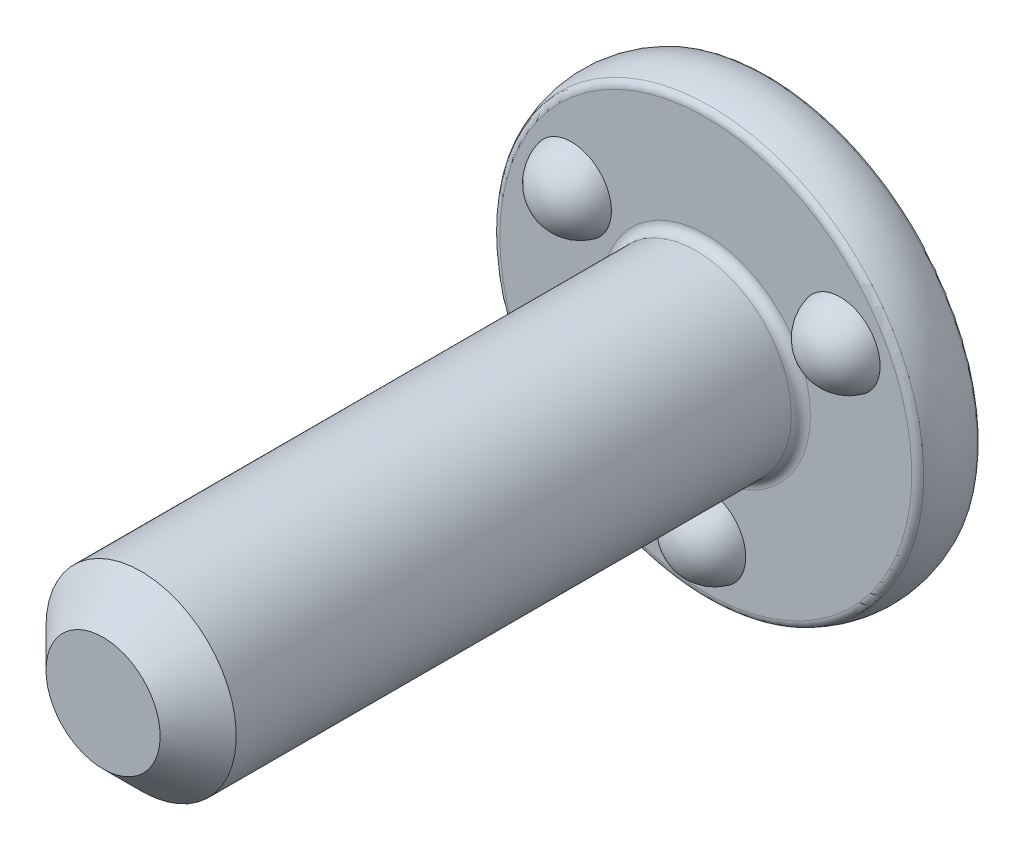
ISO-10303-21;
HEADER;
FILE_DESCRIPTION(('STEP AP214'),'2;1');
FILE_NAME('part.step','',(''),(''),'','','');
FILE_SCHEMA(('AUTOMOTIVE_DESIGN { 1 0 10303 214 1 1 1 1 }'));
ENDSEC;
DATA;
#1=APPLICATION_CONTEXT('core data for automotive mechanical design processes');
#2=APPLICATION_PROTOCOL_DEFINITION('international standard','automotive_design',2000,#1);
#3=PRODUCT_CONTEXT('',#1,'mechanical');
#4=PRODUCT('Part','Part','',(#3));
#5=PRODUCT_RELATED_PRODUCT_CATEGORY('part','',(#4));
#6=PRODUCT_DEFINITION_FORMATION('','',#4);
#7=PRODUCT_DEFINITION_CONTEXT('part definition',#1,'design');
#8=PRODUCT_DEFINITION('design','',#6,#7);
#9=PRODUCT_DEFINITION_SHAPE('','',#8);
#10=(LENGTH_UNIT() NAMED_UNIT(*) SI_UNIT(.MILLI.,.METRE.));
#11=(NAMED_UNIT(*) PLANE_ANGLE_UNIT() SI_UNIT($,.RADIAN.));
#12=(NAMED_UNIT(*) SI_UNIT($,.STERADIAN.) SOLID_ANGLE_UNIT());
#13=UNCERTAINTY_MEASURE_WITH_UNIT(LENGTH_MEASURE(1.E-05),#10,'distance_accuracy_value','');
#14=(GEOMETRIC_REPRESENTATION_CONTEXT(3) GLOBAL_UNCERTAINTY_ASSIGNED_CONTEXT((#13)) GLOBAL_UNIT_ASSIGNED_CONTEXT((#10,
#11,#12)) REPRESENTATION_CONTEXT('',''));
#15=CARTESIAN_POINT('',(0.,0.,0.));
#16=DIRECTION('',(0.,0.,1.));
#17=DIRECTION('',(1.,0.,0.));
#18=AXIS2_PLACEMENT_3D('',#15,#16,#17);
#19=CARTESIAN_POINT('',(0.,0.,-8.6868));
#20=DIRECTION('',(0.,0.,-1.));
#21=DIRECTION('',(-1.,0.,0.));
#22=AXIS2_PLACEMENT_3D('',#19,#20,#21);
#23=TOROIDAL_SURFACE('',#22,3.4925,0.3175);
#24=CARTESIAN_POINT('',(0.,0.,-8.6868));
#25=DIRECTION('',(0.,0.,-1.));
#26=DIRECTION('',(-1.,0.,0.));
#27=AXIS2_PLACEMENT_3D('',#24,#25,#26);
#28=CIRCLE('',#27,3.175);
#29=CARTESIAN_POINT('',(-3.175,0.,-8.6868));
#30=VERTEX_POINT('',#29);
#31=EDGE_CURVE('E74',#30,#30,#28,.T.);
#32=ORIENTED_EDGE('',*,*,#31,.T.);
#33=EDGE_LOOP('',(#32));
#34=FACE_BOUND('',#33,.T.);
#35=CARTESIAN_POINT('',(0.,0.,-9.0043));
#36=DIRECTION('',(0.,0.,-1.));
#37=DIRECTION('',(-1.,0.,0.));
#38=AXIS2_PLACEMENT_3D('',#35,#36,#37);
#39=CIRCLE('',#38,3.4925);
#40=CARTESIAN_POINT('',(-3.4925,0.,-9.0043));
#41=VERTEX_POINT('',#40);
#42=EDGE_CURVE('E10',#41,#41,#39,.T.);
#43=ORIENTED_EDGE('',*,*,#42,.F.);
#44=EDGE_LOOP('',(#43));
#45=FACE_BOUND('',#44,.T.);
#46=ADVANCED_FACE('F39',(#34,#45),#23,.F.);
#47=CARTESIAN_POINT('',(0.,3.4925,-9.0043));
#48=DIRECTION('',(0.,0.,1.));
#49=DIRECTION('',(1.,0.,0.));
#50=AXIS2_PLACEMENT_3D('',#47,#48,#49);
#51=PLANE('',#50);
#52=CARTESIAN_POINT('',(-4.48464760159246,2.58921249999996,-9.0043));
#53=DIRECTION('',(0.,0.,-1.));
#54=DIRECTION('',(0.499999999999992,0.866025403784443,0.));
#55=AXIS2_PLACEMENT_3D('',#52,#53,#54);
#56=CIRCLE('',#55,1.3335);
#57=CARTESIAN_POINT('',(-3.81789760159247,3.74405737594651,-9.0043));
#58=VERTEX_POINT('',#57);
#59=EDGE_CURVE('E86',#58,#58,#56,.T.);
#60=ORIENTED_EDGE('',*,*,#59,.T.);
#61=EDGE_LOOP('',(#60));
#62=FACE_BOUND('',#61,.T.);
#63=CARTESIAN_POINT('',(4.48464760159242,2.58921250000002,-9.0043));
#64=DIRECTION('',(0.,0.,-1.));
#65=DIRECTION('',(0.500000000000004,-0.866025403784436,0.));
#66=AXIS2_PLACEMENT_3D('',#63,#64,#65);
#67=CIRCLE('',#66,1.3335);
#68=CARTESIAN_POINT('',(5.15139760159243,1.43436762405348,-9.0043));
#69=VERTEX_POINT('',#68);
#70=EDGE_CURVE('E82',#69,#69,#67,.T.);
#71=ORIENTED_EDGE('',*,*,#70,.T.);
#72=EDGE_LOOP('',(#71));
#73=FACE_BOUND('',#72,.T.);
#74=CARTESIAN_POINT('',(0.,-5.178425,-9.0043));
#75=DIRECTION('',(0.,0.,-1.));
#76=DIRECTION('',(-1.,0.,0.));
#77=AXIS2_PLACEMENT_3D('',#74,#75,#76);
#78=CIRCLE('',#77,1.3335);
#79=CARTESIAN_POINT('',(-1.3335,-5.178425,-9.0043));
#80=VERTEX_POINT('',#79);
#81=EDGE_CURVE('E78',#80,#80,#78,.T.);
#82=ORIENTED_EDGE('',*,*,#81,.T.);
#83=EDGE_LOOP('',(#82));
#84=FACE_BOUND('',#83,.T.);
#85=ORIENTED_EDGE('',*,*,#42,.T.);
#86=EDGE_LOOP('',(#85));
#87=FACE_BOUND('',#86,.T.);
#88=CARTESIAN_POINT('',(0.,0.,-9.0043));
#89=DIRECTION('',(0.,0.,-1.));
#90=DIRECTION('',(-1.,0.,0.));
#91=AXIS2_PLACEMENT_3D('',#88,#89,#90);
#92=CIRCLE('',#91,6.87397239001986);
#93=CARTESIAN_POINT('',(-6.87397239001986,0.,-9.0043));
#94=VERTEX_POINT('',#93);
#95=EDGE_CURVE('E46',#94,#94,#92,.T.);
#96=ORIENTED_EDGE('',*,*,#95,.F.);
#97=EDGE_LOOP('',(#96));
#98=FACE_BOUND('',#97,.T.);
#99=ADVANCED_FACE('F91',(#62,#73,#84,#87,#98),#51,.T.);
#100=CARTESIAN_POINT('',(0.,0.,-9.267825));
#101=DIRECTION('',(0.,0.,-1.));
#102=DIRECTION('',(-1.,0.,0.));
#103=AXIS2_PLACEMENT_3D('',#100,#101,#102);
#104=TOROIDAL_SURFACE('',#103,6.87397239001986,0.263525000000001);
#105=ORIENTED_EDGE('',*,*,#95,.T.);
#106=EDGE_LOOP('',(#105));
#107=FACE_BOUND('',#106,.T.);
#108=CARTESIAN_POINT('',(0.,0.,-9.162415));
#109=DIRECTION('',(0.,0.,-1.));
#110=DIRECTION('',(-1.,0.,0.));
#111=AXIS2_PLACEMENT_3D('',#108,#109,#110);
#112=CIRCLE('',#111,7.1154970420225);
#113=CARTESIAN_POINT('',(-7.1154970420225,0.,-9.162415));
#114=VERTEX_POINT('',#113);
#115=EDGE_CURVE('E51',#114,#114,#112,.T.);
#116=ORIENTED_EDGE('',*,*,#115,.F.);
#117=EDGE_LOOP('',(#116));
#118=FACE_BOUND('',#117,.T.);
#119=ADVANCED_FACE('F110',(#107,#118),#104,.T.);
#120=CARTESIAN_POINT('',(0.,0.,-10.0584));
#121=DIRECTION('',(0.,0.,-1.));
#122=DIRECTION('',(-1.,0.,0.));
#123=AXIS2_PLACEMENT_3D('',#120,#121,#122);
#124=TOROIDAL_SURFACE('',#123,5.0625375,2.2399625);
#125=ORIENTED_EDGE('',*,*,#115,.T.);
#126=EDGE_LOOP('',(#125));
#127=FACE_BOUND('',#126,.T.);
#128=CARTESIAN_POINT('',(0.,0.,-10.954385));
#129=DIRECTION('',(0.,0.,-1.));
#130=DIRECTION('',(-1.,0.,0.));
#131=AXIS2_PLACEMENT_3D('',#128,#129,#130);
#132=CIRCLE('',#131,7.1154970420225);
#133=CARTESIAN_POINT('',(-7.1154970420225,0.,-10.954385));
#134=VERTEX_POINT('',#133);
#135=EDGE_CURVE('E56',#134,#134,#132,.T.);
#136=ORIENTED_EDGE('',*,*,#135,.F.);
#137=EDGE_LOOP('',(#136));
#138=FACE_BOUND('',#137,.T.);
#139=ADVANCED_FACE('F139',(#127,#138),#124,.T.);
#140=CARTESIAN_POINT('',(0.,0.,-10.848975));
#141=DIRECTION('',(0.,0.,-1.));
#142=DIRECTION('',(-1.,0.,0.));
#143=AXIS2_PLACEMENT_3D('',#140,#141,#142);
#144=TOROIDAL_SURFACE('',#143,6.87397239001986,0.263525000000002);
#145=ORIENTED_EDGE('',*,*,#135,.T.);
#146=EDGE_LOOP('',(#145));
#147=FACE_BOUND('',#146,.T.);
#148=CARTESIAN_POINT('',(0.,0.,-11.1125));
#149=DIRECTION('',(0.,0.,-1.));
#150=DIRECTION('',(-1.,0.,0.));
#151=AXIS2_PLACEMENT_3D('',#148,#149,#150);
#152=CIRCLE('',#151,6.87397239001986);
#153=CARTESIAN_POINT('',(-6.87397239001986,0.,-11.1125));
#154=VERTEX_POINT('',#153);
#155=EDGE_CURVE('E62',#154,#154,#152,.T.);
#156=ORIENTED_EDGE('',*,*,#155,.F.);
#157=EDGE_LOOP('',(#156));
#158=FACE_BOUND('',#157,.T.);
#159=ADVANCED_FACE('F135',(#147,#158),#144,.T.);
#160=CARTESIAN_POINT('',(0.,6.87397239001986,-11.1125));
#161=DIRECTION('',(0.,0.,-1.));
#162=DIRECTION('',(-1.,0.,0.));
#163=AXIS2_PLACEMENT_3D('',#160,#161,#162);
#164=PLANE('',#163);
#165=ORIENTED_EDGE('',*,*,#155,.T.);
#166=EDGE_LOOP('',(#165));
#167=FACE_BOUND('',#166,.T.);
#168=ADVANCED_FACE('F131',(#167),#164,.T.);
#169=CARTESIAN_POINT('',(0.,1.90499999999999,11.1125));
#170=DIRECTION('',(0.,0.,1.));
#171=DIRECTION('',(1.,0.,0.));
#172=AXIS2_PLACEMENT_3D('',#169,#170,#171);
#173=PLANE('',#172);
#174=CARTESIAN_POINT('',(0.,0.,11.1125));
#175=DIRECTION('',(0.,0.,-1.));
#176=DIRECTION('',(-1.,0.,0.));
#177=AXIS2_PLACEMENT_3D('',#174,#175,#176);
#178=CIRCLE('',#177,1.90499999999999);
#179=CARTESIAN_POINT('',(-1.90499999999999,0.,11.1125));
#180=VERTEX_POINT('',#179);
#181=EDGE_CURVE('E66',#180,#180,#178,.T.);
#182=ORIENTED_EDGE('',*,*,#181,.F.);
#183=EDGE_LOOP('',(#182));
#184=FACE_BOUND('',#183,.T.);
#185=ADVANCED_FACE('F125',(#184),#173,.T.);
#186=CARTESIAN_POINT('',(0.,0.,9.8425));
#187=DIRECTION('',(0.,0.,-1.));
#188=DIRECTION('',(-1.,0.,0.));
#189=AXIS2_PLACEMENT_3D('',#186,#187,#188);
#190=CONICAL_SURFACE('',#189,3.175,0.78539816339745);
#191=ORIENTED_EDGE('',*,*,#181,.T.);
#192=EDGE_LOOP('',(#191));
#193=FACE_BOUND('',#192,.T.);
#194=CARTESIAN_POINT('',(0.,0.,9.8425));
#195=DIRECTION('',(0.,0.,-1.));
#196=DIRECTION('',(-1.,0.,0.));
#197=AXIS2_PLACEMENT_3D('',#194,#195,#196);
#198=CIRCLE('',#197,3.175);
#199=CARTESIAN_POINT('',(-3.175,0.,9.8425));
#200=VERTEX_POINT('',#199);
#201=EDGE_CURVE('E70',#200,#200,#198,.T.);
#202=ORIENTED_EDGE('',*,*,#201,.F.);
#203=EDGE_LOOP('',(#202));
#204=FACE_BOUND('',#203,.T.);
#205=ADVANCED_FACE('F116',(#193,#204),#190,.T.);
#206=CARTESIAN_POINT('',(0.,0.,-11.1125));
#207=DIRECTION('',(0.,0.,-1.));
#208=DIRECTION('',(-1.,0.,0.));
#209=AXIS2_PLACEMENT_3D('',#206,#207,#208);
#210=CYLINDRICAL_SURFACE('',#209,3.175);
#211=ORIENTED_EDGE('',*,*,#201,.T.);
#212=EDGE_LOOP('',(#211));
#213=FACE_BOUND('',#212,.T.);
#214=ORIENTED_EDGE('',*,*,#31,.F.);
#215=EDGE_LOOP('',(#214));
#216=FACE_BOUND('',#215,.T.);
#217=ADVANCED_FACE('F114',(#213,#216),#210,.T.);
#218=CARTESIAN_POINT('',(0.,-5.178425,-9.3043375));
#219=DIRECTION('',(0.,0.,-1.));
#220=DIRECTION('',(0.,-1.,0.));
#221=AXIS2_PLACEMENT_3D('',#218,#219,#220);
#222=SPHERICAL_SURFACE('',#221,1.3668375);
#223=ORIENTED_EDGE('',*,*,#81,.F.);
#224=EDGE_LOOP('',(#223));
#225=FACE_BOUND('',#224,.T.);
#226=ADVANCED_FACE('F101',(#225),#222,.T.);
#227=CARTESIAN_POINT('',(4.48464760159242,2.58921250000002,-9.3043375));
#228=DIRECTION('',(0.,0.,-1.));
#229=DIRECTION('',(0.866025403784436,0.500000000000004,0.));
#230=AXIS2_PLACEMENT_3D('',#227,#228,#229);
#231=SPHERICAL_SURFACE('',#230,1.3668375);
#232=ORIENTED_EDGE('',*,*,#70,.F.);
#233=EDGE_LOOP('',(#232));
#234=FACE_BOUND('',#233,.T.);
#235=ADVANCED_FACE('F96',(#234),#231,.T.);
#236=CARTESIAN_POINT('',(-4.48464760159246,2.58921249999996,-9.3043375));
#237=DIRECTION('',(0.,0.,-1.));
#238=DIRECTION('',(-0.866025403784443,0.499999999999992,0.));
#239=AXIS2_PLACEMENT_3D('',#236,#237,#238);
#240=SPHERICAL_SURFACE('',#239,1.3668375);
#241=ORIENTED_EDGE('',*,*,#59,.F.);
#242=EDGE_LOOP('',(#241));
#243=FACE_BOUND('',#242,.T.);
#244=ADVANCED_FACE('F94',(#243),#240,.T.);
#245=CLOSED_SHELL('',(#46,#99,#119,#139,#159,#168,#185,#205,#217,#226,#235,#244));
#246=MANIFOLD_SOLID_BREP('B2',#245);
#247=ADVANCED_BREP_SHAPE_REPRESENTATION('',(#18,#246),#14);
#248=SHAPE_DEFINITION_REPRESENTATION(#9,#247);
ENDSEC;
END-ISO-10303-21;
